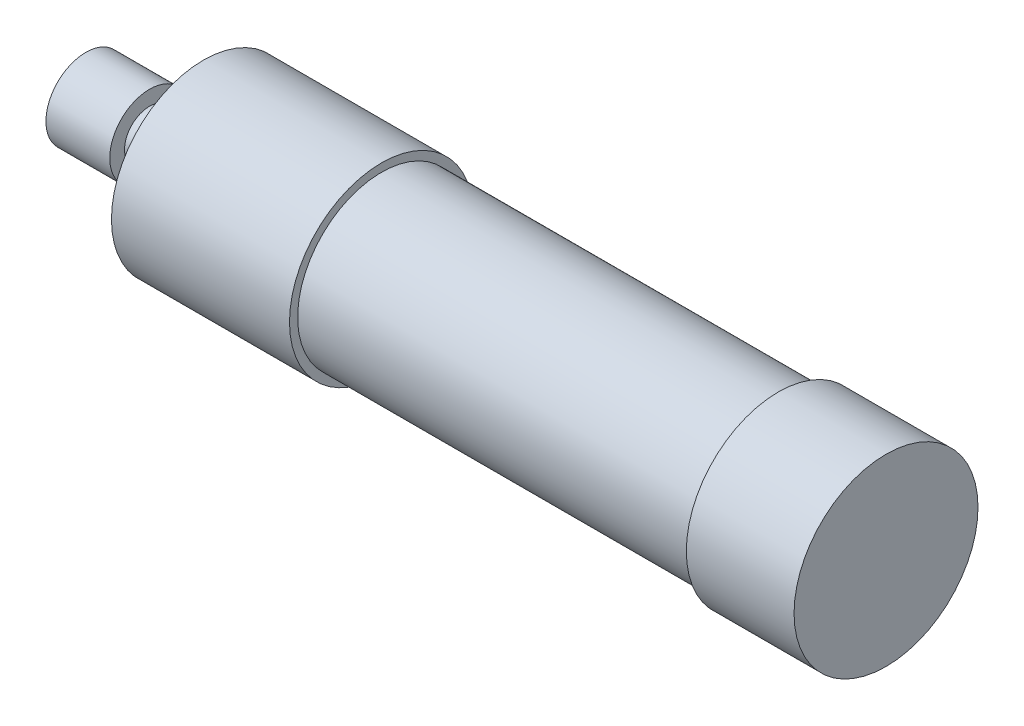
ISO-10303-21;
HEADER;
FILE_DESCRIPTION(('STEP AP214'),'2;1');
FILE_NAME('part.step','',(''),(''),'','','');
FILE_SCHEMA(('AUTOMOTIVE_DESIGN { 1 0 10303 214 1 1 1 1 }'));
ENDSEC;
DATA;
#1=APPLICATION_CONTEXT('core data for automotive mechanical design processes');
#2=APPLICATION_PROTOCOL_DEFINITION('international standard','automotive_design',2000,#1);
#3=PRODUCT_CONTEXT('',#1,'mechanical');
#4=PRODUCT('Part','Part','',(#3));
#5=PRODUCT_RELATED_PRODUCT_CATEGORY('part','',(#4));
#6=PRODUCT_DEFINITION_FORMATION('','',#4);
#7=PRODUCT_DEFINITION_CONTEXT('part definition',#1,'design');
#8=PRODUCT_DEFINITION('design','',#6,#7);
#9=PRODUCT_DEFINITION_SHAPE('','',#8);
#10=(LENGTH_UNIT() NAMED_UNIT(*) SI_UNIT(.MILLI.,.METRE.));
#11=(NAMED_UNIT(*) PLANE_ANGLE_UNIT() SI_UNIT($,.RADIAN.));
#12=(NAMED_UNIT(*) SI_UNIT($,.STERADIAN.) SOLID_ANGLE_UNIT());
#13=UNCERTAINTY_MEASURE_WITH_UNIT(LENGTH_MEASURE(1.E-05),#10,'distance_accuracy_value','');
#14=(GEOMETRIC_REPRESENTATION_CONTEXT(3) GLOBAL_UNCERTAINTY_ASSIGNED_CONTEXT((#13)) GLOBAL_UNIT_ASSIGNED_CONTEXT((#10,
#11,#12)) REPRESENTATION_CONTEXT('',''));
#15=CARTESIAN_POINT('',(0.,0.,0.));
#16=DIRECTION('',(0.,0.,1.));
#17=DIRECTION('',(1.,0.,0.));
#18=AXIS2_PLACEMENT_3D('',#15,#16,#17);
#19=CARTESIAN_POINT('',(-95.5840286043594,0.,0.));
#20=DIRECTION('',(-1.,0.,0.));
#21=DIRECTION('',(0.,0.,1.));
#22=AXIS2_PLACEMENT_3D('',#19,#20,#21);
#23=PLANE('',#22);
#24=CARTESIAN_POINT('',(-95.5840286043594,0.,0.));
#25=DIRECTION('',(1.,0.,0.));
#26=DIRECTION('',(0.,0.,-1.));
#27=AXIS2_PLACEMENT_3D('',#24,#25,#26);
#28=CIRCLE('',#27,4.7625);
#29=CARTESIAN_POINT('',(-95.5840286043594,0.,-4.7625));
#30=VERTEX_POINT('',#29);
#31=EDGE_CURVE('E11',#30,#30,#28,.T.);
#32=ORIENTED_EDGE('',*,*,#31,.F.);
#33=EDGE_LOOP('',(#32));
#34=FACE_BOUND('',#33,.T.);
#35=ADVANCED_FACE('F33',(#34),#23,.T.);
#36=CARTESIAN_POINT('',(0.,0.,0.));
#37=DIRECTION('',(1.,0.,0.));
#38=DIRECTION('',(0.,0.,-1.));
#39=AXIS2_PLACEMENT_3D('',#36,#37,#38);
#40=CYLINDRICAL_SURFACE('',#39,4.7625);
#41=ORIENTED_EDGE('',*,*,#31,.T.);
#42=EDGE_LOOP('',(#41));
#43=FACE_BOUND('',#42,.T.);
#44=CARTESIAN_POINT('',(-87.9640286043594,0.,0.));
#45=DIRECTION('',(1.,0.,0.));
#46=DIRECTION('',(0.,0.,-1.));
#47=AXIS2_PLACEMENT_3D('',#44,#45,#46);
#48=CIRCLE('',#47,4.7625);
#49=CARTESIAN_POINT('',(-87.9640286043594,0.,-4.7625));
#50=VERTEX_POINT('',#49);
#51=EDGE_CURVE('E40',#50,#50,#48,.T.);
#52=ORIENTED_EDGE('',*,*,#51,.F.);
#53=EDGE_LOOP('',(#52));
#54=FACE_BOUND('',#53,.T.);
#55=ADVANCED_FACE('F121',(#43,#54),#40,.T.);
#56=CARTESIAN_POINT('',(-87.9640286043594,4.7625,0.));
#57=DIRECTION('',(1.,0.,0.));
#58=DIRECTION('',(0.,0.,-1.));
#59=AXIS2_PLACEMENT_3D('',#56,#57,#58);
#60=PLANE('',#59);
#61=ORIENTED_EDGE('',*,*,#51,.T.);
#62=EDGE_LOOP('',(#61));
#63=FACE_BOUND('',#62,.T.);
#64=CARTESIAN_POINT('',(-87.9640286043594,0.,0.));
#65=DIRECTION('',(1.,0.,0.));
#66=DIRECTION('',(0.,0.,-1.));
#67=AXIS2_PLACEMENT_3D('',#64,#65,#66);
#68=CIRCLE('',#67,2.99719999999999);
#69=CARTESIAN_POINT('',(-87.9640286043594,0.,-2.99719999999999));
#70=VERTEX_POINT('',#69);
#71=EDGE_CURVE('E113',#70,#70,#68,.T.);
#72=ORIENTED_EDGE('',*,*,#71,.F.);
#73=EDGE_LOOP('',(#72));
#74=FACE_BOUND('',#73,.T.);
#75=ADVANCED_FACE('F118',(#63,#74),#60,.T.);
#76=CARTESIAN_POINT('',(0.,0.,0.));
#77=DIRECTION('',(1.,0.,0.));
#78=DIRECTION('',(0.,0.,-1.));
#79=AXIS2_PLACEMENT_3D('',#76,#77,#78);
#80=CYLINDRICAL_SURFACE('',#79,2.99719999999999);
#81=ORIENTED_EDGE('',*,*,#71,.T.);
#82=EDGE_LOOP('',(#81));
#83=FACE_BOUND('',#82,.T.);
#84=CARTESIAN_POINT('',(-84.790088555911,0.,0.));
#85=DIRECTION('',(1.,0.,0.));
#86=DIRECTION('',(0.,0.,-1.));
#87=AXIS2_PLACEMENT_3D('',#84,#85,#86);
#88=CIRCLE('',#87,2.99719999999999);
#89=CARTESIAN_POINT('',(-84.790088555911,0.,-2.99719999999999));
#90=VERTEX_POINT('',#89);
#91=EDGE_CURVE('E110',#90,#90,#88,.T.);
#92=ORIENTED_EDGE('',*,*,#91,.F.);
#93=EDGE_LOOP('',(#92));
#94=FACE_BOUND('',#93,.T.);
#95=ADVANCED_FACE('F128',(#83,#94),#80,.T.);
#96=CARTESIAN_POINT('',(-84.790088555911,2.99719999999999,0.));
#97=DIRECTION('',(-1.,0.,0.));
#98=DIRECTION('',(0.,0.,1.));
#99=AXIS2_PLACEMENT_3D('',#96,#97,#98);
#100=PLANE('',#99);
#101=ORIENTED_EDGE('',*,*,#91,.T.);
#102=EDGE_LOOP('',(#101));
#103=FACE_BOUND('',#102,.T.);
#104=CARTESIAN_POINT('',(-84.790088555911,0.,0.));
#105=DIRECTION('',(1.,0.,0.));
#106=DIRECTION('',(0.,0.,-1.));
#107=AXIS2_PLACEMENT_3D('',#104,#105,#106);
#108=CIRCLE('',#107,6.00709999999999);
#109=CARTESIAN_POINT('',(-84.790088555911,0.,-6.00709999999999));
#110=VERTEX_POINT('',#109);
#111=EDGE_CURVE('E107',#110,#110,#108,.T.);
#112=ORIENTED_EDGE('',*,*,#111,.F.);
#113=EDGE_LOOP('',(#112));
#114=FACE_BOUND('',#113,.T.);
#115=ADVANCED_FACE('F134',(#103,#114),#100,.T.);
#116=CARTESIAN_POINT('',(0.,0.,0.));
#117=DIRECTION('',(1.,0.,0.));
#118=DIRECTION('',(0.,0.,-1.));
#119=AXIS2_PLACEMENT_3D('',#116,#117,#118);
#120=CYLINDRICAL_SURFACE('',#119,6.00709999999999);
#121=ORIENTED_EDGE('',*,*,#111,.T.);
#122=EDGE_LOOP('',(#121));
#123=FACE_BOUND('',#122,.T.);
#124=CARTESIAN_POINT('',(-81.534,0.,0.));
#125=DIRECTION('',(1.,0.,0.));
#126=DIRECTION('',(0.,0.,-1.));
#127=AXIS2_PLACEMENT_3D('',#124,#125,#126);
#128=CIRCLE('',#127,6.00709999999999);
#129=CARTESIAN_POINT('',(-81.534,0.,-6.00709999999999));
#130=VERTEX_POINT('',#129);
#131=EDGE_CURVE('E104',#130,#130,#128,.T.);
#132=ORIENTED_EDGE('',*,*,#131,.F.);
#133=EDGE_LOOP('',(#132));
#134=FACE_BOUND('',#133,.T.);
#135=ADVANCED_FACE('F138',(#123,#134),#120,.T.);
#136=CARTESIAN_POINT('',(-81.534,6.00709999999999,0.));
#137=DIRECTION('',(-1.,0.,0.));
#138=DIRECTION('',(0.,0.,1.));
#139=AXIS2_PLACEMENT_3D('',#136,#137,#138);
#140=PLANE('',#139);
#141=CARTESIAN_POINT('',(-81.534,0.,-9.));
#142=DIRECTION('',(-1.,0.,0.));
#143=DIRECTION('',(0.,0.,1.));
#144=AXIS2_PLACEMENT_3D('',#141,#142,#143);
#145=CIRCLE('',#144,1.24999999999999);
#146=CARTESIAN_POINT('',(-81.534,0.,-7.75000000000001));
#147=VERTEX_POINT('',#146);
#148=EDGE_CURVE('E64',#147,#147,#145,.T.);
#149=ORIENTED_EDGE('',*,*,#148,.F.);
#150=EDGE_LOOP('',(#149));
#151=FACE_BOUND('',#150,.T.);
#152=CARTESIAN_POINT('',(-81.534,-9.,0.));
#153=DIRECTION('',(-1.,0.,0.));
#154=DIRECTION('',(0.,0.,1.));
#155=AXIS2_PLACEMENT_3D('',#152,#153,#154);
#156=CIRCLE('',#155,1.24999999999999);
#157=CARTESIAN_POINT('',(-81.534,-9.,1.24999999999999));
#158=VERTEX_POINT('',#157);
#159=EDGE_CURVE('E63',#158,#158,#156,.T.);
#160=ORIENTED_EDGE('',*,*,#159,.F.);
#161=EDGE_LOOP('',(#160));
#162=FACE_BOUND('',#161,.T.);
#163=CARTESIAN_POINT('',(-81.534,0.,9.));
#164=DIRECTION('',(-1.,0.,0.));
#165=DIRECTION('',(0.,0.,1.));
#166=AXIS2_PLACEMENT_3D('',#163,#164,#165);
#167=CIRCLE('',#166,1.24999999999999);
#168=CARTESIAN_POINT('',(-81.534,0.,10.25));
#169=VERTEX_POINT('',#168);
#170=EDGE_CURVE('E74',#169,#169,#167,.T.);
#171=ORIENTED_EDGE('',*,*,#170,.F.);
#172=EDGE_LOOP('',(#171));
#173=FACE_BOUND('',#172,.T.);
#174=CARTESIAN_POINT('',(-81.534,9.,0.));
#175=DIRECTION('',(-1.,0.,0.));
#176=DIRECTION('',(0.,0.,1.));
#177=AXIS2_PLACEMENT_3D('',#174,#175,#176);
#178=CIRCLE('',#177,1.24999999999999);
#179=CARTESIAN_POINT('',(-81.534,9.,1.24999999999999));
#180=VERTEX_POINT('',#179);
#181=EDGE_CURVE('E80',#180,#180,#178,.T.);
#182=ORIENTED_EDGE('',*,*,#181,.F.);
#183=EDGE_LOOP('',(#182));
#184=FACE_BOUND('',#183,.T.);
#185=ORIENTED_EDGE('',*,*,#131,.T.);
#186=EDGE_LOOP('',(#185));
#187=FACE_BOUND('',#186,.T.);
#188=CARTESIAN_POINT('',(-81.534,0.,0.));
#189=DIRECTION('',(1.,0.,0.));
#190=DIRECTION('',(0.,0.,-1.));
#191=AXIS2_PLACEMENT_3D('',#188,#189,#190);
#192=CIRCLE('',#191,10.9855);
#193=CARTESIAN_POINT('',(-81.534,0.,-10.9855));
#194=VERTEX_POINT('',#193);
#195=EDGE_CURVE('E101',#194,#194,#192,.T.);
#196=ORIENTED_EDGE('',*,*,#195,.F.);
#197=EDGE_LOOP('',(#196));
#198=FACE_BOUND('',#197,.T.);
#199=ADVANCED_FACE('F142',(#151,#162,#173,#184,#187,#198),#140,.T.);
#200=CARTESIAN_POINT('',(0.,0.,0.));
#201=DIRECTION('',(1.,0.,0.));
#202=DIRECTION('',(0.,0.,-1.));
#203=AXIS2_PLACEMENT_3D('',#200,#201,#202);
#204=CYLINDRICAL_SURFACE('',#203,10.9855);
#205=ORIENTED_EDGE('',*,*,#195,.T.);
#206=EDGE_LOOP('',(#205));
#207=FACE_BOUND('',#206,.T.);
#208=CARTESIAN_POINT('',(-60.2690725762837,0.,0.));
#209=DIRECTION('',(1.,0.,0.));
#210=DIRECTION('',(0.,0.,-1.));
#211=AXIS2_PLACEMENT_3D('',#208,#209,#210);
#212=CIRCLE('',#211,10.9855);
#213=CARTESIAN_POINT('',(-60.2690725762837,0.,-10.9855));
#214=VERTEX_POINT('',#213);
#215=EDGE_CURVE('E98',#214,#214,#212,.T.);
#216=ORIENTED_EDGE('',*,*,#215,.F.);
#217=EDGE_LOOP('',(#216));
#218=FACE_BOUND('',#217,.T.);
#219=ADVANCED_FACE('F146',(#207,#218),#204,.T.);
#220=CARTESIAN_POINT('',(-60.2690725762837,10.9855,0.));
#221=DIRECTION('',(1.,0.,0.));
#222=DIRECTION('',(0.,0.,-1.));
#223=AXIS2_PLACEMENT_3D('',#220,#221,#222);
#224=PLANE('',#223);
#225=ORIENTED_EDGE('',*,*,#215,.T.);
#226=EDGE_LOOP('',(#225));
#227=FACE_BOUND('',#226,.T.);
#228=CARTESIAN_POINT('',(-60.2690725762837,0.,0.));
#229=DIRECTION('',(1.,0.,0.));
#230=DIRECTION('',(0.,0.,-1.));
#231=AXIS2_PLACEMENT_3D('',#228,#229,#230);
#232=CIRCLE('',#231,10.0130033934249);
#233=CARTESIAN_POINT('',(-60.2690725762837,0.,-10.0130033934249));
#234=VERTEX_POINT('',#233);
#235=EDGE_CURVE('E95',#234,#234,#232,.T.);
#236=ORIENTED_EDGE('',*,*,#235,.F.);
#237=EDGE_LOOP('',(#236));
#238=FACE_BOUND('',#237,.T.);
#239=ADVANCED_FACE('F150',(#227,#238),#224,.T.);
#240=CARTESIAN_POINT('',(0.,0.,0.));
#241=DIRECTION('',(1.,0.,0.));
#242=DIRECTION('',(0.,0.,-1.));
#243=AXIS2_PLACEMENT_3D('',#240,#241,#242);
#244=CYLINDRICAL_SURFACE('',#243,10.0130033934249);
#245=ORIENTED_EDGE('',*,*,#235,.T.);
#246=EDGE_LOOP('',(#245));
#247=FACE_BOUND('',#246,.T.);
#248=CARTESIAN_POINT('',(-12.8695967113582,0.,0.));
#249=DIRECTION('',(1.,0.,0.));
#250=DIRECTION('',(0.,0.,-1.));
#251=AXIS2_PLACEMENT_3D('',#248,#249,#250);
#252=CIRCLE('',#251,10.0130033934249);
#253=CARTESIAN_POINT('',(-12.8695967113582,0.,-10.0130033934249));
#254=VERTEX_POINT('',#253);
#255=EDGE_CURVE('E92',#254,#254,#252,.T.);
#256=ORIENTED_EDGE('',*,*,#255,.F.);
#257=EDGE_LOOP('',(#256));
#258=FACE_BOUND('',#257,.T.);
#259=ADVANCED_FACE('F154',(#247,#258),#244,.T.);
#260=CARTESIAN_POINT('',(-12.8695967113582,10.0130033934249,0.));
#261=DIRECTION('',(-1.,0.,0.));
#262=DIRECTION('',(0.,0.,1.));
#263=AXIS2_PLACEMENT_3D('',#260,#261,#262);
#264=PLANE('',#263);
#265=ORIENTED_EDGE('',*,*,#255,.T.);
#266=EDGE_LOOP('',(#265));
#267=FACE_BOUND('',#266,.T.);
#268=CARTESIAN_POINT('',(-12.8695967113582,0.,0.));
#269=DIRECTION('',(1.,0.,0.));
#270=DIRECTION('',(0.,0.,-1.));
#271=AXIS2_PLACEMENT_3D('',#268,#269,#270);
#272=CIRCLE('',#271,10.9855);
#273=CARTESIAN_POINT('',(-12.8695967113582,0.,-10.9855));
#274=VERTEX_POINT('',#273);
#275=EDGE_CURVE('E89',#274,#274,#272,.T.);
#276=ORIENTED_EDGE('',*,*,#275,.F.);
#277=EDGE_LOOP('',(#276));
#278=FACE_BOUND('',#277,.T.);
#279=ADVANCED_FACE('F158',(#267,#278),#264,.T.);
#280=CARTESIAN_POINT('',(0.,0.,0.));
#281=DIRECTION('',(1.,0.,0.));
#282=DIRECTION('',(0.,0.,-1.));
#283=AXIS2_PLACEMENT_3D('',#280,#281,#282);
#284=CYLINDRICAL_SURFACE('',#283,10.9855);
#285=ORIENTED_EDGE('',*,*,#275,.T.);
#286=EDGE_LOOP('',(#285));
#287=FACE_BOUND('',#286,.T.);
#288=CARTESIAN_POINT('',(0.,0.,0.));
#289=DIRECTION('',(1.,0.,0.));
#290=DIRECTION('',(0.,0.,-1.));
#291=AXIS2_PLACEMENT_3D('',#288,#289,#290);
#292=CIRCLE('',#291,10.9855);
#293=CARTESIAN_POINT('',(0.,0.,-10.9855));
#294=VERTEX_POINT('',#293);
#295=EDGE_CURVE('E86',#294,#294,#292,.T.);
#296=ORIENTED_EDGE('',*,*,#295,.F.);
#297=EDGE_LOOP('',(#296));
#298=FACE_BOUND('',#297,.T.);
#299=ADVANCED_FACE('F162',(#287,#298),#284,.T.);
#300=CARTESIAN_POINT('',(0.,10.9855,0.));
#301=DIRECTION('',(1.,0.,0.));
#302=DIRECTION('',(0.,0.,-1.));
#303=AXIS2_PLACEMENT_3D('',#300,#301,#302);
#304=PLANE('',#303);
#305=ORIENTED_EDGE('',*,*,#295,.T.);
#306=EDGE_LOOP('',(#305));
#307=FACE_BOUND('',#306,.T.);
#308=ADVANCED_FACE('F166',(#307),#304,.T.);
#309=CARTESIAN_POINT('',(-68.834,9.,0.));
#310=DIRECTION('',(-1.,0.,0.));
#311=DIRECTION('',(0.,0.,1.));
#312=AXIS2_PLACEMENT_3D('',#309,#310,#311);
#313=CONICAL_SURFACE('',#312,1.25,1.02974425867666);
#314=CARTESIAN_POINT('',(-68.0829242262156,9.,0.));
#315=VERTEX_POINT('',#314);
#316=VERTEX_LOOP('',#315);
#317=FACE_BOUND('',#316,.T.);
#318=CARTESIAN_POINT('',(-68.834,9.,0.));
#319=DIRECTION('',(-1.,0.,0.));
#320=DIRECTION('',(0.,0.,1.));
#321=AXIS2_PLACEMENT_3D('',#318,#319,#320);
#322=CIRCLE('',#321,1.25);
#323=CARTESIAN_POINT('',(-68.834,9.,1.25));
#324=VERTEX_POINT('',#323);
#325=EDGE_CURVE('E83',#324,#324,#322,.T.);
#326=ORIENTED_EDGE('',*,*,#325,.T.);
#327=EDGE_LOOP('',(#326));
#328=FACE_BOUND('',#327,.T.);
#329=ADVANCED_FACE('F170',(#317,#328),#313,.F.);
#330=CARTESIAN_POINT('',(-81.534,9.,0.));
#331=DIRECTION('',(-1.,0.,0.));
#332=DIRECTION('',(0.,0.,1.));
#333=AXIS2_PLACEMENT_3D('',#330,#331,#332);
#334=CYLINDRICAL_SURFACE('',#333,1.24999999999999);
#335=ORIENTED_EDGE('',*,*,#325,.F.);
#336=EDGE_LOOP('',(#335));
#337=FACE_BOUND('',#336,.T.);
#338=ORIENTED_EDGE('',*,*,#181,.T.);
#339=EDGE_LOOP('',(#338));
#340=FACE_BOUND('',#339,.T.);
#341=ADVANCED_FACE('F174',(#337,#340),#334,.F.);
#342=CARTESIAN_POINT('',(-68.834,0.,9.));
#343=DIRECTION('',(-1.,0.,0.));
#344=DIRECTION('',(0.,0.,1.));
#345=AXIS2_PLACEMENT_3D('',#342,#343,#344);
#346=CONICAL_SURFACE('',#345,1.25,1.02974425867666);
#347=CARTESIAN_POINT('',(-68.0829242262156,0.,9.));
#348=VERTEX_POINT('',#347);
#349=VERTEX_LOOP('',#348);
#350=FACE_BOUND('',#349,.T.);
#351=CARTESIAN_POINT('',(-68.834,0.,9.));
#352=DIRECTION('',(-1.,0.,0.));
#353=DIRECTION('',(0.,0.,1.));
#354=AXIS2_PLACEMENT_3D('',#351,#352,#353);
#355=CIRCLE('',#354,1.25);
#356=CARTESIAN_POINT('',(-68.834,0.,10.25));
#357=VERTEX_POINT('',#356);
#358=EDGE_CURVE('E77',#357,#357,#355,.T.);
#359=ORIENTED_EDGE('',*,*,#358,.T.);
#360=EDGE_LOOP('',(#359));
#361=FACE_BOUND('',#360,.T.);
#362=ADVANCED_FACE('F177',(#350,#361),#346,.F.);
#363=CARTESIAN_POINT('',(-81.534,0.,9.));
#364=DIRECTION('',(-1.,0.,0.));
#365=DIRECTION('',(0.,0.,1.));
#366=AXIS2_PLACEMENT_3D('',#363,#364,#365);
#367=CYLINDRICAL_SURFACE('',#366,1.24999999999999);
#368=ORIENTED_EDGE('',*,*,#358,.F.);
#369=EDGE_LOOP('',(#368));
#370=FACE_BOUND('',#369,.T.);
#371=ORIENTED_EDGE('',*,*,#170,.T.);
#372=EDGE_LOOP('',(#371));
#373=FACE_BOUND('',#372,.T.);
#374=ADVANCED_FACE('F181',(#370,#373),#367,.F.);
#375=CARTESIAN_POINT('',(-68.834,-9.,0.));
#376=DIRECTION('',(-1.,0.,0.));
#377=DIRECTION('',(0.,0.,1.));
#378=AXIS2_PLACEMENT_3D('',#375,#376,#377);
#379=CONICAL_SURFACE('',#378,1.25,1.02974425867666);
#380=CARTESIAN_POINT('',(-68.0829242262156,-9.,0.));
#381=VERTEX_POINT('',#380);
#382=VERTEX_LOOP('',#381);
#383=FACE_BOUND('',#382,.T.);
#384=CARTESIAN_POINT('',(-68.834,-9.,0.));
#385=DIRECTION('',(-1.,0.,0.));
#386=DIRECTION('',(0.,0.,1.));
#387=AXIS2_PLACEMENT_3D('',#384,#385,#386);
#388=CIRCLE('',#387,1.25);
#389=CARTESIAN_POINT('',(-68.834,-9.,1.25));
#390=VERTEX_POINT('',#389);
#391=EDGE_CURVE('E67',#390,#390,#388,.T.);
#392=ORIENTED_EDGE('',*,*,#391,.T.);
#393=EDGE_LOOP('',(#392));
#394=FACE_BOUND('',#393,.T.);
#395=ADVANCED_FACE('F184',(#383,#394),#379,.F.);
#396=CARTESIAN_POINT('',(-81.534,-9.,0.));
#397=DIRECTION('',(-1.,0.,0.));
#398=DIRECTION('',(0.,0.,1.));
#399=AXIS2_PLACEMENT_3D('',#396,#397,#398);
#400=CYLINDRICAL_SURFACE('',#399,1.24999999999999);
#401=ORIENTED_EDGE('',*,*,#391,.F.);
#402=EDGE_LOOP('',(#401));
#403=FACE_BOUND('',#402,.T.);
#404=ORIENTED_EDGE('',*,*,#159,.T.);
#405=EDGE_LOOP('',(#404));
#406=FACE_BOUND('',#405,.T.);
#407=ADVANCED_FACE('F57',(#403,#406),#400,.F.);
#408=CARTESIAN_POINT('',(-68.834,0.,-9.));
#409=DIRECTION('',(-1.,0.,0.));
#410=DIRECTION('',(0.,0.,1.));
#411=AXIS2_PLACEMENT_3D('',#408,#409,#410);
#412=CONICAL_SURFACE('',#411,1.25,1.02974425867666);
#413=CARTESIAN_POINT('',(-68.0829242262156,0.,-9.));
#414=VERTEX_POINT('',#413);
#415=VERTEX_LOOP('',#414);
#416=FACE_BOUND('',#415,.T.);
#417=CARTESIAN_POINT('',(-68.834,0.,-9.));
#418=DIRECTION('',(-1.,0.,0.));
#419=DIRECTION('',(0.,0.,1.));
#420=AXIS2_PLACEMENT_3D('',#417,#418,#419);
#421=CIRCLE('',#420,1.25);
#422=CARTESIAN_POINT('',(-68.834,0.,-7.75));
#423=VERTEX_POINT('',#422);
#424=EDGE_CURVE('E61',#423,#423,#421,.T.);
#425=ORIENTED_EDGE('',*,*,#424,.T.);
#426=EDGE_LOOP('',(#425));
#427=FACE_BOUND('',#426,.T.);
#428=ADVANCED_FACE('F53',(#416,#427),#412,.F.);
#429=CARTESIAN_POINT('',(-81.534,0.,-9.));
#430=DIRECTION('',(-1.,0.,0.));
#431=DIRECTION('',(0.,0.,1.));
#432=AXIS2_PLACEMENT_3D('',#429,#430,#431);
#433=CYLINDRICAL_SURFACE('',#432,1.24999999999999);
#434=ORIENTED_EDGE('',*,*,#424,.F.);
#435=EDGE_LOOP('',(#434));
#436=FACE_BOUND('',#435,.T.);
#437=ORIENTED_EDGE('',*,*,#148,.T.);
#438=EDGE_LOOP('',(#437));
#439=FACE_BOUND('',#438,.T.);
#440=ADVANCED_FACE('F56',(#436,#439),#433,.F.);
#441=CLOSED_SHELL('',(#35,#55,#75,#95,#115,#135,#199,#219,#239,#259,#279,#299,#308,#329,#341,
#362,#374,#395,#407,#428,#440));
#442=MANIFOLD_SOLID_BREP('B2',#441);
#443=ADVANCED_BREP_SHAPE_REPRESENTATION('',(#18,#442),#14);
#444=SHAPE_DEFINITION_REPRESENTATION(#9,#443);
ENDSEC;
END-ISO-10303-21;
